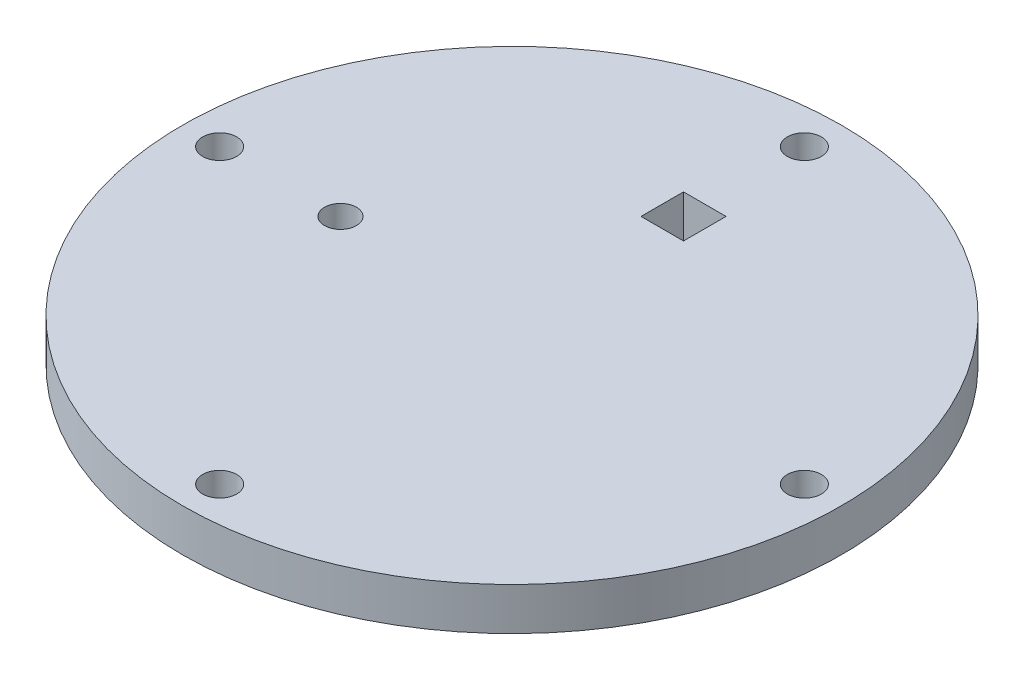
ISO-10303-21;
HEADER;
FILE_DESCRIPTION(('STEP AP214'),'2;1');
FILE_NAME('part.step','',(''),(''),'','','');
FILE_SCHEMA(('AUTOMOTIVE_DESIGN { 1 0 10303 214 1 1 1 1 }'));
ENDSEC;
DATA;
#1=APPLICATION_CONTEXT('core data for automotive mechanical design processes');
#2=APPLICATION_PROTOCOL_DEFINITION('international standard','automotive_design',2000,#1);
#3=PRODUCT_CONTEXT('',#1,'mechanical');
#4=PRODUCT('Part','Part','',(#3));
#5=PRODUCT_RELATED_PRODUCT_CATEGORY('part','',(#4));
#6=PRODUCT_DEFINITION_FORMATION('','',#4);
#7=PRODUCT_DEFINITION_CONTEXT('part definition',#1,'design');
#8=PRODUCT_DEFINITION('design','',#6,#7);
#9=PRODUCT_DEFINITION_SHAPE('','',#8);
#10=(LENGTH_UNIT() NAMED_UNIT(*) SI_UNIT(.MILLI.,.METRE.));
#11=(NAMED_UNIT(*) PLANE_ANGLE_UNIT() SI_UNIT($,.RADIAN.));
#12=(NAMED_UNIT(*) SI_UNIT($,.STERADIAN.) SOLID_ANGLE_UNIT());
#13=UNCERTAINTY_MEASURE_WITH_UNIT(LENGTH_MEASURE(1.E-05),#10,'distance_accuracy_value','');
#14=(GEOMETRIC_REPRESENTATION_CONTEXT(3) GLOBAL_UNCERTAINTY_ASSIGNED_CONTEXT((#13)) GLOBAL_UNIT_ASSIGNED_CONTEXT((#10,
#11,#12)) REPRESENTATION_CONTEXT('',''));
#15=CARTESIAN_POINT('',(0.,0.,0.));
#16=DIRECTION('',(0.,0.,1.));
#17=DIRECTION('',(1.,0.,0.));
#18=AXIS2_PLACEMENT_3D('',#15,#16,#17);
#19=CARTESIAN_POINT('',(0.,4.,0.));
#20=DIRECTION('',(0.,-1.,0.));
#21=DIRECTION('',(0.,0.,-1.));
#22=AXIS2_PLACEMENT_3D('',#19,#20,#21);
#23=CYLINDRICAL_SURFACE('',#22,31.);
#24=CARTESIAN_POINT('',(0.,4.,0.));
#25=DIRECTION('',(0.,1.,0.));
#26=DIRECTION('',(0.,0.,1.));
#27=AXIS2_PLACEMENT_3D('',#24,#25,#26);
#28=CIRCLE('',#27,31.);
#29=CARTESIAN_POINT('',(0.,4.,31.));
#30=VERTEX_POINT('',#29);
#31=EDGE_CURVE('E11',#30,#30,#28,.T.);
#32=ORIENTED_EDGE('',*,*,#31,.F.);
#33=EDGE_LOOP('',(#32));
#34=FACE_BOUND('',#33,.T.);
#35=CARTESIAN_POINT('',(0.,0.,0.));
#36=DIRECTION('',(0.,1.,0.));
#37=DIRECTION('',(0.,0.,1.));
#38=AXIS2_PLACEMENT_3D('',#35,#36,#37);
#39=CIRCLE('',#38,31.);
#40=CARTESIAN_POINT('',(0.,0.,31.));
#41=VERTEX_POINT('',#40);
#42=EDGE_CURVE('E36',#41,#41,#39,.T.);
#43=ORIENTED_EDGE('',*,*,#42,.T.);
#44=EDGE_LOOP('',(#43));
#45=FACE_BOUND('',#44,.T.);
#46=ADVANCED_FACE('F33',(#34,#45),#23,.T.);
#47=CARTESIAN_POINT('',(0.,4.,0.));
#48=DIRECTION('',(0.,1.,0.));
#49=DIRECTION('',(0.,0.,1.));
#50=AXIS2_PLACEMENT_3D('',#47,#48,#49);
#51=PLANE('',#50);
#52=DIRECTION('',(0.,0.,1.));
#53=VECTOR('',#52,1.);
#54=CARTESIAN_POINT('',(-2.,4.,-18.135));
#55=LINE('',#54,#53);
#56=CARTESIAN_POINT('',(-2.,4.,-18.135));
#57=VERTEX_POINT('',#56);
#58=CARTESIAN_POINT('',(-2.,4.,-14.135));
#59=VERTEX_POINT('',#58);
#60=EDGE_CURVE('E47',#57,#59,#55,.T.);
#61=ORIENTED_EDGE('',*,*,#60,.F.);
#62=DIRECTION('',(1.,0.,0.));
#63=VECTOR('',#62,1.);
#64=CARTESIAN_POINT('',(-2.,4.,-18.135));
#65=LINE('',#64,#63);
#66=CARTESIAN_POINT('',(2.,4.,-18.135));
#67=VERTEX_POINT('',#66);
#68=EDGE_CURVE('E89',#57,#67,#65,.T.);
#69=ORIENTED_EDGE('',*,*,#68,.T.);
#70=DIRECTION('',(0.,0.,1.));
#71=VECTOR('',#70,1.);
#72=CARTESIAN_POINT('',(2.,4.,-18.135));
#73=LINE('',#72,#71);
#74=CARTESIAN_POINT('',(2.,4.,-14.135));
#75=VERTEX_POINT('',#74);
#76=EDGE_CURVE('E92',#67,#75,#73,.T.);
#77=ORIENTED_EDGE('',*,*,#76,.T.);
#78=DIRECTION('',(1.,0.,0.));
#79=VECTOR('',#78,1.);
#80=CARTESIAN_POINT('',(-2.,4.,-14.135));
#81=LINE('',#80,#79);
#82=EDGE_CURVE('E98',#59,#75,#81,.T.);
#83=ORIENTED_EDGE('',*,*,#82,.F.);
#84=EDGE_LOOP('',(#61,#69,#77,#83));
#85=FACE_BOUND('',#84,.T.);
#86=CARTESIAN_POINT('',(-16.135,4.,0.));
#87=DIRECTION('',(0.,1.,0.));
#88=DIRECTION('',(0.,0.,1.));
#89=AXIS2_PLACEMENT_3D('',#86,#87,#88);
#90=CIRCLE('',#89,1.5);
#91=CARTESIAN_POINT('',(-16.135,4.,1.5));
#92=VERTEX_POINT('',#91);
#93=EDGE_CURVE('E104',#92,#92,#90,.T.);
#94=ORIENTED_EDGE('',*,*,#93,.F.);
#95=EDGE_LOOP('',(#94));
#96=FACE_BOUND('',#95,.T.);
#97=CARTESIAN_POINT('',(-27.5,4.,0.));
#98=DIRECTION('',(0.,1.,0.));
#99=DIRECTION('',(0.,0.,1.));
#100=AXIS2_PLACEMENT_3D('',#97,#98,#99);
#101=CIRCLE('',#100,1.59999999999999);
#102=CARTESIAN_POINT('',(-27.5,4.,1.59999999999999));
#103=VERTEX_POINT('',#102);
#104=EDGE_CURVE('E113',#103,#103,#101,.T.);
#105=ORIENTED_EDGE('',*,*,#104,.F.);
#106=EDGE_LOOP('',(#105));
#107=FACE_BOUND('',#106,.T.);
#108=CARTESIAN_POINT('',(27.5,4.,0.));
#109=DIRECTION('',(0.,1.,0.));
#110=DIRECTION('',(0.,0.,1.));
#111=AXIS2_PLACEMENT_3D('',#108,#109,#110);
#112=CIRCLE('',#111,1.59999999999999);
#113=CARTESIAN_POINT('',(27.5,4.,1.59999999999999));
#114=VERTEX_POINT('',#113);
#115=EDGE_CURVE('E119',#114,#114,#112,.T.);
#116=ORIENTED_EDGE('',*,*,#115,.F.);
#117=EDGE_LOOP('',(#116));
#118=FACE_BOUND('',#117,.T.);
#119=CARTESIAN_POINT('',(0.,4.,-27.5));
#120=DIRECTION('',(0.,1.,0.));
#121=DIRECTION('',(0.,0.,1.));
#122=AXIS2_PLACEMENT_3D('',#119,#120,#121);
#123=CIRCLE('',#122,1.59999999999999);
#124=CARTESIAN_POINT('',(0.,4.,-25.9));
#125=VERTEX_POINT('',#124);
#126=EDGE_CURVE('E125',#125,#125,#123,.T.);
#127=ORIENTED_EDGE('',*,*,#126,.F.);
#128=EDGE_LOOP('',(#127));
#129=FACE_BOUND('',#128,.T.);
#130=CARTESIAN_POINT('',(0.,4.,27.5));
#131=DIRECTION('',(0.,1.,0.));
#132=DIRECTION('',(0.,0.,1.));
#133=AXIS2_PLACEMENT_3D('',#130,#131,#132);
#134=CIRCLE('',#133,1.59999999999999);
#135=CARTESIAN_POINT('',(0.,4.,29.1));
#136=VERTEX_POINT('',#135);
#137=EDGE_CURVE('E131',#136,#136,#134,.T.);
#138=ORIENTED_EDGE('',*,*,#137,.F.);
#139=EDGE_LOOP('',(#138));
#140=FACE_BOUND('',#139,.T.);
#141=ORIENTED_EDGE('',*,*,#31,.T.);
#142=EDGE_LOOP('',(#141));
#143=FACE_BOUND('',#142,.T.);
#144=ADVANCED_FACE('F144',(#85,#96,#107,#118,#129,#140,#143),#51,.T.);
#145=CARTESIAN_POINT('',(0.,0.,0.));
#146=DIRECTION('',(0.,1.,0.));
#147=DIRECTION('',(0.,0.,1.));
#148=AXIS2_PLACEMENT_3D('',#145,#146,#147);
#149=PLANE('',#148);
#150=DIRECTION('',(1.,0.,0.));
#151=VECTOR('',#150,1.);
#152=CARTESIAN_POINT('',(-2.,0.,-18.135));
#153=LINE('',#152,#151);
#154=CARTESIAN_POINT('',(-2.,0.,-18.135));
#155=VERTEX_POINT('',#154);
#156=CARTESIAN_POINT('',(2.,0.,-18.135));
#157=VERTEX_POINT('',#156);
#158=EDGE_CURVE('E78',#155,#157,#153,.T.);
#159=ORIENTED_EDGE('',*,*,#158,.F.);
#160=DIRECTION('',(0.,0.,1.));
#161=VECTOR('',#160,1.);
#162=CARTESIAN_POINT('',(-2.,0.,-18.135));
#163=LINE('',#162,#161);
#164=CARTESIAN_POINT('',(-2.,0.,-14.135));
#165=VERTEX_POINT('',#164);
#166=EDGE_CURVE('E75',#155,#165,#163,.T.);
#167=ORIENTED_EDGE('',*,*,#166,.T.);
#168=DIRECTION('',(1.,0.,0.));
#169=VECTOR('',#168,1.);
#170=CARTESIAN_POINT('',(-2.,0.,-14.135));
#171=LINE('',#170,#169);
#172=CARTESIAN_POINT('',(2.,0.,-14.135));
#173=VERTEX_POINT('',#172);
#174=EDGE_CURVE('E81',#165,#173,#171,.T.);
#175=ORIENTED_EDGE('',*,*,#174,.T.);
#176=DIRECTION('',(0.,0.,1.));
#177=VECTOR('',#176,1.);
#178=CARTESIAN_POINT('',(2.,0.,-18.135));
#179=LINE('',#178,#177);
#180=EDGE_CURVE('E85',#157,#173,#179,.T.);
#181=ORIENTED_EDGE('',*,*,#180,.F.);
#182=EDGE_LOOP('',(#159,#167,#175,#181));
#183=FACE_BOUND('',#182,.T.);
#184=CARTESIAN_POINT('',(-16.135,0.,0.));
#185=DIRECTION('',(0.,1.,0.));
#186=DIRECTION('',(0.,0.,1.));
#187=AXIS2_PLACEMENT_3D('',#184,#185,#186);
#188=CIRCLE('',#187,1.5);
#189=CARTESIAN_POINT('',(-16.135,0.,1.5));
#190=VERTEX_POINT('',#189);
#191=EDGE_CURVE('E110',#190,#190,#188,.T.);
#192=ORIENTED_EDGE('',*,*,#191,.T.);
#193=EDGE_LOOP('',(#192));
#194=FACE_BOUND('',#193,.T.);
#195=CARTESIAN_POINT('',(-27.5,0.,0.));
#196=DIRECTION('',(0.,1.,0.));
#197=DIRECTION('',(0.,0.,1.));
#198=AXIS2_PLACEMENT_3D('',#195,#196,#197);
#199=CIRCLE('',#198,1.6);
#200=CARTESIAN_POINT('',(-27.5,0.,1.6));
#201=VERTEX_POINT('',#200);
#202=EDGE_CURVE('E116',#201,#201,#199,.T.);
#203=ORIENTED_EDGE('',*,*,#202,.T.);
#204=EDGE_LOOP('',(#203));
#205=FACE_BOUND('',#204,.T.);
#206=CARTESIAN_POINT('',(27.5,0.,0.));
#207=DIRECTION('',(0.,1.,0.));
#208=DIRECTION('',(0.,0.,1.));
#209=AXIS2_PLACEMENT_3D('',#206,#207,#208);
#210=CIRCLE('',#209,1.6);
#211=CARTESIAN_POINT('',(27.5,0.,1.6));
#212=VERTEX_POINT('',#211);
#213=EDGE_CURVE('E122',#212,#212,#210,.T.);
#214=ORIENTED_EDGE('',*,*,#213,.T.);
#215=EDGE_LOOP('',(#214));
#216=FACE_BOUND('',#215,.T.);
#217=CARTESIAN_POINT('',(0.,0.,-27.5));
#218=DIRECTION('',(0.,1.,0.));
#219=DIRECTION('',(0.,0.,1.));
#220=AXIS2_PLACEMENT_3D('',#217,#218,#219);
#221=CIRCLE('',#220,1.6);
#222=CARTESIAN_POINT('',(0.,0.,-25.9));
#223=VERTEX_POINT('',#222);
#224=EDGE_CURVE('E128',#223,#223,#221,.T.);
#225=ORIENTED_EDGE('',*,*,#224,.T.);
#226=EDGE_LOOP('',(#225));
#227=FACE_BOUND('',#226,.T.);
#228=CARTESIAN_POINT('',(0.,0.,27.5));
#229=DIRECTION('',(0.,1.,0.));
#230=DIRECTION('',(0.,0.,1.));
#231=AXIS2_PLACEMENT_3D('',#228,#229,#230);
#232=CIRCLE('',#231,1.6);
#233=CARTESIAN_POINT('',(0.,0.,29.1));
#234=VERTEX_POINT('',#233);
#235=EDGE_CURVE('E134',#234,#234,#232,.T.);
#236=ORIENTED_EDGE('',*,*,#235,.T.);
#237=EDGE_LOOP('',(#236));
#238=FACE_BOUND('',#237,.T.);
#239=ORIENTED_EDGE('',*,*,#42,.F.);
#240=EDGE_LOOP('',(#239));
#241=FACE_BOUND('',#240,.T.);
#242=ADVANCED_FACE('F87',(#183,#194,#205,#216,#227,#238,#241),#149,.F.);
#243=CARTESIAN_POINT('',(0.,4.,27.5));
#244=DIRECTION('',(0.,1.,0.));
#245=DIRECTION('',(0.,0.,1.));
#246=AXIS2_PLACEMENT_3D('',#243,#244,#245);
#247=CYLINDRICAL_SURFACE('',#246,1.59999999999999);
#248=ORIENTED_EDGE('',*,*,#235,.F.);
#249=EDGE_LOOP('',(#248));
#250=FACE_BOUND('',#249,.T.);
#251=ORIENTED_EDGE('',*,*,#137,.T.);
#252=EDGE_LOOP('',(#251));
#253=FACE_BOUND('',#252,.T.);
#254=ADVANCED_FACE('F143',(#250,#253),#247,.F.);
#255=CARTESIAN_POINT('',(0.,4.,-27.5));
#256=DIRECTION('',(0.,1.,0.));
#257=DIRECTION('',(0.,0.,1.));
#258=AXIS2_PLACEMENT_3D('',#255,#256,#257);
#259=CYLINDRICAL_SURFACE('',#258,1.59999999999999);
#260=ORIENTED_EDGE('',*,*,#224,.F.);
#261=EDGE_LOOP('',(#260));
#262=FACE_BOUND('',#261,.T.);
#263=ORIENTED_EDGE('',*,*,#126,.T.);
#264=EDGE_LOOP('',(#263));
#265=FACE_BOUND('',#264,.T.);
#266=ADVANCED_FACE('F149',(#262,#265),#259,.F.);
#267=CARTESIAN_POINT('',(27.5,4.,0.));
#268=DIRECTION('',(0.,1.,0.));
#269=DIRECTION('',(0.,0.,1.));
#270=AXIS2_PLACEMENT_3D('',#267,#268,#269);
#271=CYLINDRICAL_SURFACE('',#270,1.59999999999999);
#272=ORIENTED_EDGE('',*,*,#213,.F.);
#273=EDGE_LOOP('',(#272));
#274=FACE_BOUND('',#273,.T.);
#275=ORIENTED_EDGE('',*,*,#115,.T.);
#276=EDGE_LOOP('',(#275));
#277=FACE_BOUND('',#276,.T.);
#278=ADVANCED_FACE('F222',(#274,#277),#271,.F.);
#279=CARTESIAN_POINT('',(-27.5,4.,0.));
#280=DIRECTION('',(0.,1.,0.));
#281=DIRECTION('',(0.,0.,1.));
#282=AXIS2_PLACEMENT_3D('',#279,#280,#281);
#283=CYLINDRICAL_SURFACE('',#282,1.59999999999999);
#284=ORIENTED_EDGE('',*,*,#202,.F.);
#285=EDGE_LOOP('',(#284));
#286=FACE_BOUND('',#285,.T.);
#287=ORIENTED_EDGE('',*,*,#104,.T.);
#288=EDGE_LOOP('',(#287));
#289=FACE_BOUND('',#288,.T.);
#290=ADVANCED_FACE('F218',(#286,#289),#283,.F.);
#291=CARTESIAN_POINT('',(-16.135,4.,0.));
#292=DIRECTION('',(0.,1.,0.));
#293=DIRECTION('',(0.,0.,1.));
#294=AXIS2_PLACEMENT_3D('',#291,#292,#293);
#295=CYLINDRICAL_SURFACE('',#294,1.5);
#296=ORIENTED_EDGE('',*,*,#191,.F.);
#297=EDGE_LOOP('',(#296));
#298=FACE_BOUND('',#297,.T.);
#299=ORIENTED_EDGE('',*,*,#93,.T.);
#300=EDGE_LOOP('',(#299));
#301=FACE_BOUND('',#300,.T.);
#302=ADVANCED_FACE('F171',(#298,#301),#295,.F.);
#303=CARTESIAN_POINT('',(-2.,0.,-18.135));
#304=DIRECTION('',(-1.,0.,0.));
#305=DIRECTION('',(0.,0.,1.));
#306=AXIS2_PLACEMENT_3D('',#303,#304,#305);
#307=PLANE('',#306);
#308=ORIENTED_EDGE('',*,*,#60,.T.);
#309=DIRECTION('',(0.,1.,0.));
#310=VECTOR('',#309,1.);
#311=CARTESIAN_POINT('',(-2.,0.,-14.135));
#312=LINE('',#311,#310);
#313=EDGE_CURVE('E72',#165,#59,#312,.T.);
#314=ORIENTED_EDGE('',*,*,#313,.F.);
#315=ORIENTED_EDGE('',*,*,#166,.F.);
#316=DIRECTION('',(0.,1.,0.));
#317=VECTOR('',#316,1.);
#318=CARTESIAN_POINT('',(-2.,0.,-18.135));
#319=LINE('',#318,#317);
#320=EDGE_CURVE('E102',#155,#57,#319,.T.);
#321=ORIENTED_EDGE('',*,*,#320,.T.);
#322=EDGE_LOOP('',(#308,#314,#315,#321));
#323=FACE_BOUND('',#322,.T.);
#324=ADVANCED_FACE('F73',(#323),#307,.F.);
#325=CARTESIAN_POINT('',(-2.,0.,-18.135));
#326=DIRECTION('',(0.,0.,1.));
#327=DIRECTION('',(1.,0.,0.));
#328=AXIS2_PLACEMENT_3D('',#325,#326,#327);
#329=PLANE('',#328);
#330=ORIENTED_EDGE('',*,*,#68,.F.);
#331=ORIENTED_EDGE('',*,*,#320,.F.);
#332=ORIENTED_EDGE('',*,*,#158,.T.);
#333=DIRECTION('',(0.,1.,0.));
#334=VECTOR('',#333,1.);
#335=CARTESIAN_POINT('',(2.,0.,-18.135));
#336=LINE('',#335,#334);
#337=EDGE_CURVE('E105',#157,#67,#336,.T.);
#338=ORIENTED_EDGE('',*,*,#337,.T.);
#339=EDGE_LOOP('',(#330,#331,#332,#338));
#340=FACE_BOUND('',#339,.T.);
#341=ADVANCED_FACE('F185',(#340),#329,.T.);
#342=CARTESIAN_POINT('',(2.,0.,-18.135));
#343=DIRECTION('',(-1.,0.,0.));
#344=DIRECTION('',(0.,0.,1.));
#345=AXIS2_PLACEMENT_3D('',#342,#343,#344);
#346=PLANE('',#345);
#347=ORIENTED_EDGE('',*,*,#76,.F.);
#348=ORIENTED_EDGE('',*,*,#337,.F.);
#349=ORIENTED_EDGE('',*,*,#180,.T.);
#350=DIRECTION('',(0.,1.,0.));
#351=VECTOR('',#350,1.);
#352=CARTESIAN_POINT('',(2.,0.,-14.135));
#353=LINE('',#352,#351);
#354=EDGE_CURVE('E55',#173,#75,#353,.T.);
#355=ORIENTED_EDGE('',*,*,#354,.T.);
#356=EDGE_LOOP('',(#347,#348,#349,#355));
#357=FACE_BOUND('',#356,.T.);
#358=ADVANCED_FACE('F194',(#357),#346,.T.);
#359=CARTESIAN_POINT('',(-2.,0.,-14.135));
#360=DIRECTION('',(0.,0.,1.));
#361=DIRECTION('',(1.,0.,0.));
#362=AXIS2_PLACEMENT_3D('',#359,#360,#361);
#363=PLANE('',#362);
#364=ORIENTED_EDGE('',*,*,#82,.T.);
#365=ORIENTED_EDGE('',*,*,#354,.F.);
#366=ORIENTED_EDGE('',*,*,#174,.F.);
#367=ORIENTED_EDGE('',*,*,#313,.T.);
#368=EDGE_LOOP('',(#364,#365,#366,#367));
#369=FACE_BOUND('',#368,.T.);
#370=ADVANCED_FACE('F82',(#369),#363,.F.);
#371=CLOSED_SHELL('',(#46,#144,#242,#254,#266,#278,#290,#302,#324,#341,#358,#370));
#372=MANIFOLD_SOLID_BREP('B2',#371);
#373=ADVANCED_BREP_SHAPE_REPRESENTATION('',(#18,#372),#14);
#374=SHAPE_DEFINITION_REPRESENTATION(#9,#373);
ENDSEC;
END-ISO-10303-21;
